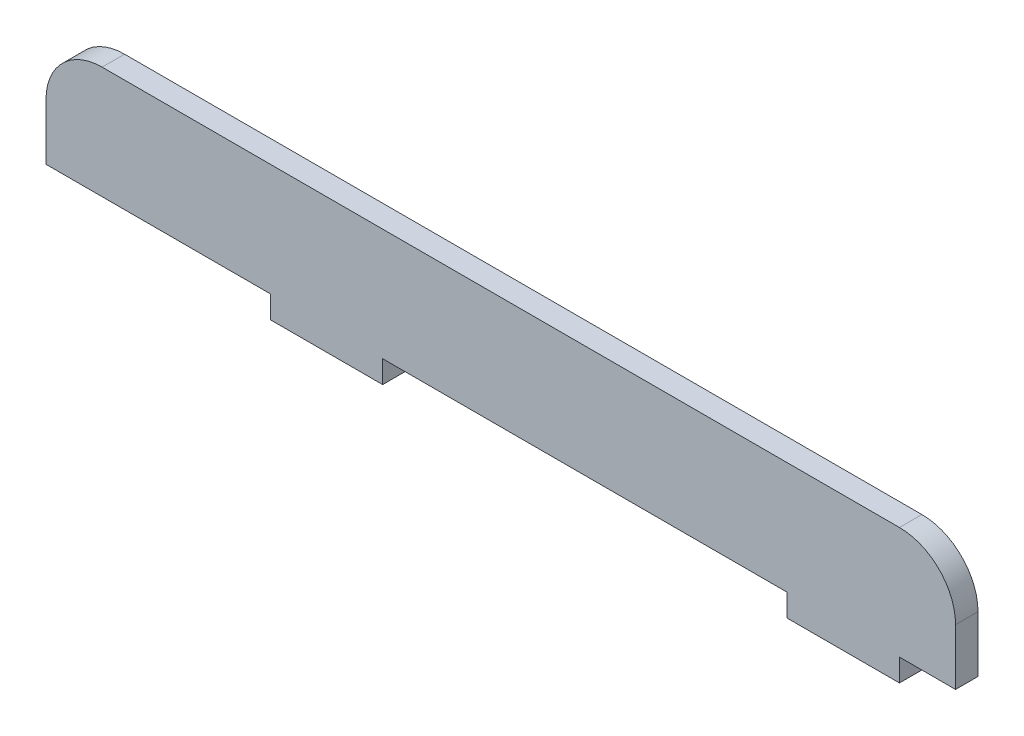
ISO-10303-21;
HEADER;
FILE_DESCRIPTION(('STEP AP214'),'2;1');
FILE_NAME('part.step','',(''),(''),'','','');
FILE_SCHEMA(('AUTOMOTIVE_DESIGN { 1 0 10303 214 1 1 1 1 }'));
ENDSEC;
DATA;
#1=APPLICATION_CONTEXT('core data for automotive mechanical design processes');
#2=APPLICATION_PROTOCOL_DEFINITION('international standard','automotive_design',2000,#1);
#3=PRODUCT_CONTEXT('',#1,'mechanical');
#4=PRODUCT('Part','Part','',(#3));
#5=PRODUCT_RELATED_PRODUCT_CATEGORY('part','',(#4));
#6=PRODUCT_DEFINITION_FORMATION('','',#4);
#7=PRODUCT_DEFINITION_CONTEXT('part definition',#1,'design');
#8=PRODUCT_DEFINITION('design','',#6,#7);
#9=PRODUCT_DEFINITION_SHAPE('','',#8);
#10=(LENGTH_UNIT() NAMED_UNIT(*) SI_UNIT(.MILLI.,.METRE.));
#11=(NAMED_UNIT(*) PLANE_ANGLE_UNIT() SI_UNIT($,.RADIAN.));
#12=(NAMED_UNIT(*) SI_UNIT($,.STERADIAN.) SOLID_ANGLE_UNIT());
#13=UNCERTAINTY_MEASURE_WITH_UNIT(LENGTH_MEASURE(1.E-05),#10,'distance_accuracy_value','');
#14=(GEOMETRIC_REPRESENTATION_CONTEXT(3) GLOBAL_UNCERTAINTY_ASSIGNED_CONTEXT((#13)) GLOBAL_UNIT_ASSIGNED_CONTEXT((#10,
#11,#12)) REPRESENTATION_CONTEXT('',''));
#15=CARTESIAN_POINT('',(0.,0.,0.));
#16=DIRECTION('',(0.,0.,1.));
#17=DIRECTION('',(1.,0.,0.));
#18=AXIS2_PLACEMENT_3D('',#15,#16,#17);
#19=CARTESIAN_POINT('',(17.9,4.,84.));
#20=DIRECTION('',(0.,1.,0.));
#21=DIRECTION('',(0.,0.,1.));
#22=AXIS2_PLACEMENT_3D('',#19,#20,#21);
#23=PLANE('',#22);
#24=DIRECTION('',(1.,0.,0.));
#25=VECTOR('',#24,1.);
#26=CARTESIAN_POINT('',(17.9,4.,80.));
#27=LINE('',#26,#25);
#28=CARTESIAN_POINT('',(-22.1,4.,80.));
#29=VERTEX_POINT('',#28);
#30=CARTESIAN_POINT('',(17.9,4.,80.));
#31=VERTEX_POINT('',#30);
#32=EDGE_CURVE('E162',#29,#31,#27,.T.);
#33=ORIENTED_EDGE('',*,*,#32,.T.);
#34=DIRECTION('',(0.,0.,-1.));
#35=VECTOR('',#34,1.);
#36=CARTESIAN_POINT('',(17.9,4.,84.));
#37=LINE('',#36,#35);
#38=CARTESIAN_POINT('',(17.9,4.,84.));
#39=VERTEX_POINT('',#38);
#40=EDGE_CURVE('E11',#39,#31,#37,.T.);
#41=ORIENTED_EDGE('',*,*,#40,.F.);
#42=DIRECTION('',(1.,0.,0.));
#43=VECTOR('',#42,1.);
#44=CARTESIAN_POINT('',(17.9,4.,84.));
#45=LINE('',#44,#43);
#46=CARTESIAN_POINT('',(-22.1,4.,84.));
#47=VERTEX_POINT('',#46);
#48=EDGE_CURVE('E188',#47,#39,#45,.T.);
#49=ORIENTED_EDGE('',*,*,#48,.F.);
#50=DIRECTION('',(0.,0.,-1.));
#51=VECTOR('',#50,1.);
#52=CARTESIAN_POINT('',(-22.1,4.,84.));
#53=LINE('',#52,#51);
#54=EDGE_CURVE('E158',#47,#29,#53,.T.);
#55=ORIENTED_EDGE('',*,*,#54,.T.);
#56=EDGE_LOOP('',(#33,#41,#49,#55));
#57=FACE_BOUND('',#56,.T.);
#58=ADVANCED_FACE('F30',(#57),#23,.F.);
#59=CARTESIAN_POINT('',(17.9,0.,84.));
#60=DIRECTION('',(1.,0.,0.));
#61=DIRECTION('',(0.,0.,-1.));
#62=AXIS2_PLACEMENT_3D('',#59,#60,#61);
#63=PLANE('',#62);
#64=DIRECTION('',(0.,-1.,0.));
#65=VECTOR('',#64,1.);
#66=CARTESIAN_POINT('',(17.9,0.,80.));
#67=LINE('',#66,#65);
#68=CARTESIAN_POINT('',(17.9,0.,80.));
#69=VERTEX_POINT('',#68);
#70=EDGE_CURVE('E165',#31,#69,#67,.T.);
#71=ORIENTED_EDGE('',*,*,#70,.T.);
#72=DIRECTION('',(0.,0.,-1.));
#73=VECTOR('',#72,1.);
#74=CARTESIAN_POINT('',(17.9,0.,84.));
#75=LINE('',#74,#73);
#76=CARTESIAN_POINT('',(17.9,0.,84.));
#77=VERTEX_POINT('',#76);
#78=EDGE_CURVE('E38',#77,#69,#75,.T.);
#79=ORIENTED_EDGE('',*,*,#78,.F.);
#80=DIRECTION('',(0.,-1.,0.));
#81=VECTOR('',#80,1.);
#82=CARTESIAN_POINT('',(17.9,0.,84.));
#83=LINE('',#82,#81);
#84=EDGE_CURVE('E107',#39,#77,#83,.T.);
#85=ORIENTED_EDGE('',*,*,#84,.F.);
#86=ORIENTED_EDGE('',*,*,#40,.T.);
#87=EDGE_LOOP('',(#71,#79,#85,#86));
#88=FACE_BOUND('',#87,.T.);
#89=ADVANCED_FACE('F276',(#88),#63,.F.);
#90=CARTESIAN_POINT('',(37.9,0.,84.));
#91=DIRECTION('',(0.,1.,0.));
#92=DIRECTION('',(0.,0.,1.));
#93=AXIS2_PLACEMENT_3D('',#90,#91,#92);
#94=PLANE('',#93);
#95=DIRECTION('',(1.,0.,0.));
#96=VECTOR('',#95,1.);
#97=CARTESIAN_POINT('',(37.9,0.,80.));
#98=LINE('',#97,#96);
#99=CARTESIAN_POINT('',(37.9,0.,80.));
#100=VERTEX_POINT('',#99);
#101=EDGE_CURVE('E167',#69,#100,#98,.T.);
#102=ORIENTED_EDGE('',*,*,#101,.T.);
#103=DIRECTION('',(0.,0.,-1.));
#104=VECTOR('',#103,1.);
#105=CARTESIAN_POINT('',(37.9,0.,84.));
#106=LINE('',#105,#104);
#107=CARTESIAN_POINT('',(37.9,0.,84.));
#108=VERTEX_POINT('',#107);
#109=EDGE_CURVE('E213',#108,#100,#106,.T.);
#110=ORIENTED_EDGE('',*,*,#109,.F.);
#111=DIRECTION('',(1.,0.,0.));
#112=VECTOR('',#111,1.);
#113=CARTESIAN_POINT('',(37.9,0.,84.));
#114=LINE('',#113,#112);
#115=EDGE_CURVE('E221',#77,#108,#114,.T.);
#116=ORIENTED_EDGE('',*,*,#115,.F.);
#117=ORIENTED_EDGE('',*,*,#78,.T.);
#118=EDGE_LOOP('',(#102,#110,#116,#117));
#119=FACE_BOUND('',#118,.T.);
#120=ADVANCED_FACE('F219',(#119),#94,.F.);
#121=CARTESIAN_POINT('',(37.9,4.,84.));
#122=DIRECTION('',(-1.,0.,0.));
#123=DIRECTION('',(0.,0.,1.));
#124=AXIS2_PLACEMENT_3D('',#121,#122,#123);
#125=PLANE('',#124);
#126=DIRECTION('',(0.,1.,0.));
#127=VECTOR('',#126,1.);
#128=CARTESIAN_POINT('',(37.9,4.,80.));
#129=LINE('',#128,#127);
#130=CARTESIAN_POINT('',(37.9,4.,80.));
#131=VERTEX_POINT('',#130);
#132=EDGE_CURVE('E169',#100,#131,#129,.T.);
#133=ORIENTED_EDGE('',*,*,#132,.T.);
#134=DIRECTION('',(0.,0.,-1.));
#135=VECTOR('',#134,1.);
#136=CARTESIAN_POINT('',(37.9,4.,84.));
#137=LINE('',#136,#135);
#138=CARTESIAN_POINT('',(37.9,4.,84.));
#139=VERTEX_POINT('',#138);
#140=EDGE_CURVE('E210',#139,#131,#137,.T.);
#141=ORIENTED_EDGE('',*,*,#140,.F.);
#142=DIRECTION('',(0.,1.,0.));
#143=VECTOR('',#142,1.);
#144=CARTESIAN_POINT('',(37.9,4.,84.));
#145=LINE('',#144,#143);
#146=EDGE_CURVE('E239',#108,#139,#145,.T.);
#147=ORIENTED_EDGE('',*,*,#146,.F.);
#148=ORIENTED_EDGE('',*,*,#109,.T.);
#149=EDGE_LOOP('',(#133,#141,#147,#148));
#150=FACE_BOUND('',#149,.T.);
#151=ADVANCED_FACE('F230',(#150),#125,.F.);
#152=CARTESIAN_POINT('',(110.,4.,84.));
#153=DIRECTION('',(0.,1.,0.));
#154=DIRECTION('',(0.,0.,1.));
#155=AXIS2_PLACEMENT_3D('',#152,#153,#154);
#156=PLANE('',#155);
#157=DIRECTION('',(1.,0.,0.));
#158=VECTOR('',#157,1.);
#159=CARTESIAN_POINT('',(110.,4.,80.));
#160=LINE('',#159,#158);
#161=CARTESIAN_POINT('',(110.,4.,80.));
#162=VERTEX_POINT('',#161);
#163=EDGE_CURVE('E171',#131,#162,#160,.T.);
#164=ORIENTED_EDGE('',*,*,#163,.T.);
#165=DIRECTION('',(0.,0.,-1.));
#166=VECTOR('',#165,1.);
#167=CARTESIAN_POINT('',(110.,4.,84.));
#168=LINE('',#167,#166);
#169=CARTESIAN_POINT('',(110.,4.,84.));
#170=VERTEX_POINT('',#169);
#171=EDGE_CURVE('E207',#170,#162,#168,.T.);
#172=ORIENTED_EDGE('',*,*,#171,.F.);
#173=DIRECTION('',(1.,0.,0.));
#174=VECTOR('',#173,1.);
#175=CARTESIAN_POINT('',(110.,4.,84.));
#176=LINE('',#175,#174);
#177=EDGE_CURVE('E236',#139,#170,#176,.T.);
#178=ORIENTED_EDGE('',*,*,#177,.F.);
#179=ORIENTED_EDGE('',*,*,#140,.T.);
#180=EDGE_LOOP('',(#164,#172,#178,#179));
#181=FACE_BOUND('',#180,.T.);
#182=ADVANCED_FACE('F234',(#181),#156,.F.);
#183=CARTESIAN_POINT('',(110.,0.,84.));
#184=DIRECTION('',(1.,0.,0.));
#185=DIRECTION('',(0.,0.,-1.));
#186=AXIS2_PLACEMENT_3D('',#183,#184,#185);
#187=PLANE('',#186);
#188=DIRECTION('',(0.,-1.,0.));
#189=VECTOR('',#188,1.);
#190=CARTESIAN_POINT('',(110.,0.,80.));
#191=LINE('',#190,#189);
#192=CARTESIAN_POINT('',(110.,0.,80.));
#193=VERTEX_POINT('',#192);
#194=EDGE_CURVE('E173',#162,#193,#191,.T.);
#195=ORIENTED_EDGE('',*,*,#194,.T.);
#196=DIRECTION('',(0.,0.,-1.));
#197=VECTOR('',#196,1.);
#198=CARTESIAN_POINT('',(110.,0.,84.));
#199=LINE('',#198,#197);
#200=CARTESIAN_POINT('',(110.,0.,84.));
#201=VERTEX_POINT('',#200);
#202=EDGE_CURVE('E204',#201,#193,#199,.T.);
#203=ORIENTED_EDGE('',*,*,#202,.F.);
#204=DIRECTION('',(0.,-1.,0.));
#205=VECTOR('',#204,1.);
#206=CARTESIAN_POINT('',(110.,0.,84.));
#207=LINE('',#206,#205);
#208=EDGE_CURVE('E238',#170,#201,#207,.T.);
#209=ORIENTED_EDGE('',*,*,#208,.F.);
#210=ORIENTED_EDGE('',*,*,#171,.T.);
#211=EDGE_LOOP('',(#195,#203,#209,#210));
#212=FACE_BOUND('',#211,.T.);
#213=ADVANCED_FACE('F289',(#212),#187,.F.);
#214=CARTESIAN_POINT('',(130.,0.,84.));
#215=DIRECTION('',(0.,1.,0.));
#216=DIRECTION('',(0.,0.,1.));
#217=AXIS2_PLACEMENT_3D('',#214,#215,#216);
#218=PLANE('',#217);
#219=DIRECTION('',(1.,0.,0.));
#220=VECTOR('',#219,1.);
#221=CARTESIAN_POINT('',(130.,0.,80.));
#222=LINE('',#221,#220);
#223=CARTESIAN_POINT('',(130.,0.,80.));
#224=VERTEX_POINT('',#223);
#225=EDGE_CURVE('E175',#193,#224,#222,.T.);
#226=ORIENTED_EDGE('',*,*,#225,.T.);
#227=DIRECTION('',(0.,0.,-1.));
#228=VECTOR('',#227,1.);
#229=CARTESIAN_POINT('',(130.,0.,84.));
#230=LINE('',#229,#228);
#231=CARTESIAN_POINT('',(130.,0.,84.));
#232=VERTEX_POINT('',#231);
#233=EDGE_CURVE('E201',#232,#224,#230,.T.);
#234=ORIENTED_EDGE('',*,*,#233,.F.);
#235=DIRECTION('',(1.,0.,0.));
#236=VECTOR('',#235,1.);
#237=CARTESIAN_POINT('',(130.,0.,84.));
#238=LINE('',#237,#236);
#239=EDGE_CURVE('E241',#201,#232,#238,.T.);
#240=ORIENTED_EDGE('',*,*,#239,.F.);
#241=ORIENTED_EDGE('',*,*,#202,.T.);
#242=EDGE_LOOP('',(#226,#234,#240,#241));
#243=FACE_BOUND('',#242,.T.);
#244=ADVANCED_FACE('F292',(#243),#218,.F.);
#245=CARTESIAN_POINT('',(130.,4.,84.));
#246=DIRECTION('',(-1.,0.,0.));
#247=DIRECTION('',(0.,0.,1.));
#248=AXIS2_PLACEMENT_3D('',#245,#246,#247);
#249=PLANE('',#248);
#250=DIRECTION('',(0.,1.,0.));
#251=VECTOR('',#250,1.);
#252=CARTESIAN_POINT('',(130.,4.,80.));
#253=LINE('',#252,#251);
#254=CARTESIAN_POINT('',(130.,4.,80.));
#255=VERTEX_POINT('',#254);
#256=EDGE_CURVE('E177',#224,#255,#253,.T.);
#257=ORIENTED_EDGE('',*,*,#256,.T.);
#258=DIRECTION('',(0.,0.,-1.));
#259=VECTOR('',#258,1.);
#260=CARTESIAN_POINT('',(130.,4.,84.));
#261=LINE('',#260,#259);
#262=CARTESIAN_POINT('',(130.,4.,84.));
#263=VERTEX_POINT('',#262);
#264=EDGE_CURVE('E198',#263,#255,#261,.T.);
#265=ORIENTED_EDGE('',*,*,#264,.F.);
#266=DIRECTION('',(0.,1.,0.));
#267=VECTOR('',#266,1.);
#268=CARTESIAN_POINT('',(130.,4.,84.));
#269=LINE('',#268,#267);
#270=EDGE_CURVE('E247',#232,#263,#269,.T.);
#271=ORIENTED_EDGE('',*,*,#270,.F.);
#272=ORIENTED_EDGE('',*,*,#233,.T.);
#273=EDGE_LOOP('',(#257,#265,#271,#272));
#274=FACE_BOUND('',#273,.T.);
#275=ADVANCED_FACE('F296',(#274),#249,.F.);
#276=CARTESIAN_POINT('',(140.,4.,84.));
#277=DIRECTION('',(0.,1.,0.));
#278=DIRECTION('',(0.,0.,1.));
#279=AXIS2_PLACEMENT_3D('',#276,#277,#278);
#280=PLANE('',#279);
#281=DIRECTION('',(1.,0.,0.));
#282=VECTOR('',#281,1.);
#283=CARTESIAN_POINT('',(140.,4.,80.));
#284=LINE('',#283,#282);
#285=CARTESIAN_POINT('',(140.,4.,80.));
#286=VERTEX_POINT('',#285);
#287=EDGE_CURVE('E179',#255,#286,#284,.T.);
#288=ORIENTED_EDGE('',*,*,#287,.T.);
#289=DIRECTION('',(0.,0.,-1.));
#290=VECTOR('',#289,1.);
#291=CARTESIAN_POINT('',(140.,4.,84.));
#292=LINE('',#291,#290);
#293=CARTESIAN_POINT('',(140.,4.,84.));
#294=VERTEX_POINT('',#293);
#295=EDGE_CURVE('E195',#294,#286,#292,.T.);
#296=ORIENTED_EDGE('',*,*,#295,.F.);
#297=DIRECTION('',(1.,0.,0.));
#298=VECTOR('',#297,1.);
#299=CARTESIAN_POINT('',(140.,4.,84.));
#300=LINE('',#299,#298);
#301=EDGE_CURVE('E249',#263,#294,#300,.T.);
#302=ORIENTED_EDGE('',*,*,#301,.F.);
#303=ORIENTED_EDGE('',*,*,#264,.T.);
#304=EDGE_LOOP('',(#288,#296,#302,#303));
#305=FACE_BOUND('',#304,.T.);
#306=ADVANCED_FACE('F300',(#305),#280,.F.);
#307=CARTESIAN_POINT('',(140.,14.,84.));
#308=DIRECTION('',(-1.,0.,0.));
#309=DIRECTION('',(0.,0.,1.));
#310=AXIS2_PLACEMENT_3D('',#307,#308,#309);
#311=PLANE('',#310);
#312=DIRECTION('',(0.,1.,0.));
#313=VECTOR('',#312,1.);
#314=CARTESIAN_POINT('',(140.,14.,80.));
#315=LINE('',#314,#313);
#316=CARTESIAN_POINT('',(140.,14.,80.));
#317=VERTEX_POINT('',#316);
#318=EDGE_CURVE('E181',#286,#317,#315,.T.);
#319=ORIENTED_EDGE('',*,*,#318,.T.);
#320=DIRECTION('',(0.,0.,-1.));
#321=VECTOR('',#320,1.);
#322=CARTESIAN_POINT('',(140.,14.,84.));
#323=LINE('',#322,#321);
#324=CARTESIAN_POINT('',(140.,14.,84.));
#325=VERTEX_POINT('',#324);
#326=EDGE_CURVE('E192',#325,#317,#323,.T.);
#327=ORIENTED_EDGE('',*,*,#326,.F.);
#328=DIRECTION('',(0.,1.,0.));
#329=VECTOR('',#328,1.);
#330=CARTESIAN_POINT('',(140.,14.,84.));
#331=LINE('',#330,#329);
#332=EDGE_CURVE('E251',#294,#325,#331,.T.);
#333=ORIENTED_EDGE('',*,*,#332,.F.);
#334=ORIENTED_EDGE('',*,*,#295,.T.);
#335=EDGE_LOOP('',(#319,#327,#333,#334));
#336=FACE_BOUND('',#335,.T.);
#337=ADVANCED_FACE('F257',(#336),#311,.F.);
#338=CARTESIAN_POINT('',(130.,14.,84.));
#339=DIRECTION('',(0.,0.,-1.));
#340=DIRECTION('',(-1.,0.,0.));
#341=AXIS2_PLACEMENT_3D('',#338,#339,#340);
#342=CYLINDRICAL_SURFACE('',#341,10.);
#343=CARTESIAN_POINT('',(130.,14.,80.));
#344=DIRECTION('',(0.,0.,1.));
#345=DIRECTION('',(-1.,0.,0.));
#346=AXIS2_PLACEMENT_3D('',#343,#344,#345);
#347=CIRCLE('',#346,10.);
#348=CARTESIAN_POINT('',(130.,24.,80.));
#349=VERTEX_POINT('',#348);
#350=EDGE_CURVE('E183',#317,#349,#347,.T.);
#351=ORIENTED_EDGE('',*,*,#350,.T.);
#352=DIRECTION('',(0.,0.,-1.));
#353=VECTOR('',#352,1.);
#354=CARTESIAN_POINT('',(130.,24.,84.));
#355=LINE('',#354,#353);
#356=CARTESIAN_POINT('',(130.,24.,84.));
#357=VERTEX_POINT('',#356);
#358=EDGE_CURVE('E153',#357,#349,#355,.T.);
#359=ORIENTED_EDGE('',*,*,#358,.F.);
#360=CARTESIAN_POINT('',(130.,14.,84.));
#361=DIRECTION('',(0.,0.,1.));
#362=DIRECTION('',(-1.,0.,0.));
#363=AXIS2_PLACEMENT_3D('',#360,#361,#362);
#364=CIRCLE('',#363,10.);
#365=EDGE_CURVE('E144',#325,#357,#364,.T.);
#366=ORIENTED_EDGE('',*,*,#365,.F.);
#367=ORIENTED_EDGE('',*,*,#326,.T.);
#368=EDGE_LOOP('',(#351,#359,#366,#367));
#369=FACE_BOUND('',#368,.T.);
#370=ADVANCED_FACE('F261',(#369),#342,.T.);
#371=CARTESIAN_POINT('',(-12.0999999999999,24.,84.));
#372=DIRECTION('',(0.,-1.,0.));
#373=DIRECTION('',(1.,0.,0.));
#374=AXIS2_PLACEMENT_3D('',#371,#372,#373);
#375=PLANE('',#374);
#376=DIRECTION('',(-1.,0.,0.));
#377=VECTOR('',#376,1.);
#378=CARTESIAN_POINT('',(-12.0999999999999,24.,80.));
#379=LINE('',#378,#377);
#380=CARTESIAN_POINT('',(-12.0999999999999,24.,80.));
#381=VERTEX_POINT('',#380);
#382=EDGE_CURVE('E152',#349,#381,#379,.T.);
#383=ORIENTED_EDGE('',*,*,#382,.T.);
#384=DIRECTION('',(0.,0.,-1.));
#385=VECTOR('',#384,1.);
#386=CARTESIAN_POINT('',(-12.0999999999999,24.,84.));
#387=LINE('',#386,#385);
#388=CARTESIAN_POINT('',(-12.0999999999999,24.,84.));
#389=VERTEX_POINT('',#388);
#390=EDGE_CURVE('E149',#389,#381,#387,.T.);
#391=ORIENTED_EDGE('',*,*,#390,.F.);
#392=DIRECTION('',(-1.,0.,0.));
#393=VECTOR('',#392,1.);
#394=CARTESIAN_POINT('',(-12.0999999999999,24.,84.));
#395=LINE('',#394,#393);
#396=EDGE_CURVE('E138',#357,#389,#395,.T.);
#397=ORIENTED_EDGE('',*,*,#396,.F.);
#398=ORIENTED_EDGE('',*,*,#358,.T.);
#399=EDGE_LOOP('',(#383,#391,#397,#398));
#400=FACE_BOUND('',#399,.T.);
#401=ADVANCED_FACE('F150',(#400),#375,.F.);
#402=CARTESIAN_POINT('',(-12.1,14.,84.));
#403=DIRECTION('',(0.,0.,-1.));
#404=DIRECTION('',(-1.,0.,0.));
#405=AXIS2_PLACEMENT_3D('',#402,#403,#404);
#406=CYLINDRICAL_SURFACE('',#405,10.);
#407=CARTESIAN_POINT('',(-12.1,14.,80.));
#408=DIRECTION('',(0.,0.,1.));
#409=DIRECTION('',(-1.,0.,0.));
#410=AXIS2_PLACEMENT_3D('',#407,#408,#409);
#411=CIRCLE('',#410,10.);
#412=CARTESIAN_POINT('',(-22.1,13.9999999999999,80.));
#413=VERTEX_POINT('',#412);
#414=EDGE_CURVE('E93',#381,#413,#411,.T.);
#415=ORIENTED_EDGE('',*,*,#414,.T.);
#416=DIRECTION('',(0.,0.,-1.));
#417=VECTOR('',#416,1.);
#418=CARTESIAN_POINT('',(-22.1,13.9999999999999,84.));
#419=LINE('',#418,#417);
#420=CARTESIAN_POINT('',(-22.1,13.9999999999999,84.));
#421=VERTEX_POINT('',#420);
#422=EDGE_CURVE('E154',#421,#413,#419,.T.);
#423=ORIENTED_EDGE('',*,*,#422,.F.);
#424=CARTESIAN_POINT('',(-12.1,14.,84.));
#425=DIRECTION('',(0.,0.,1.));
#426=DIRECTION('',(-1.,0.,0.));
#427=AXIS2_PLACEMENT_3D('',#424,#425,#426);
#428=CIRCLE('',#427,10.);
#429=EDGE_CURVE('E142',#389,#421,#428,.T.);
#430=ORIENTED_EDGE('',*,*,#429,.F.);
#431=ORIENTED_EDGE('',*,*,#390,.T.);
#432=EDGE_LOOP('',(#415,#423,#430,#431));
#433=FACE_BOUND('',#432,.T.);
#434=ADVANCED_FACE('F156',(#433),#406,.T.);
#435=CARTESIAN_POINT('',(-22.1,4.,84.));
#436=DIRECTION('',(1.,0.,0.));
#437=DIRECTION('',(0.,0.,-1.));
#438=AXIS2_PLACEMENT_3D('',#435,#436,#437);
#439=PLANE('',#438);
#440=DIRECTION('',(0.,-1.,0.));
#441=VECTOR('',#440,1.);
#442=CARTESIAN_POINT('',(-22.1,4.,80.));
#443=LINE('',#442,#441);
#444=EDGE_CURVE('E99',#413,#29,#443,.T.);
#445=ORIENTED_EDGE('',*,*,#444,.T.);
#446=ORIENTED_EDGE('',*,*,#54,.F.);
#447=DIRECTION('',(0.,-1.,0.));
#448=VECTOR('',#447,1.);
#449=CARTESIAN_POINT('',(-22.1,4.,84.));
#450=LINE('',#449,#448);
#451=EDGE_CURVE('E46',#421,#47,#450,.T.);
#452=ORIENTED_EDGE('',*,*,#451,.F.);
#453=ORIENTED_EDGE('',*,*,#422,.T.);
#454=EDGE_LOOP('',(#445,#446,#452,#453));
#455=FACE_BOUND('',#454,.T.);
#456=ADVANCED_FACE('F265',(#455),#439,.F.);
#457=CARTESIAN_POINT('',(-12.1,14.,84.));
#458=DIRECTION('',(0.,0.,-1.));
#459=DIRECTION('',(-1.,0.,0.));
#460=AXIS2_PLACEMENT_3D('',#457,#458,#459);
#461=PLANE('',#460);
#462=ORIENTED_EDGE('',*,*,#48,.T.);
#463=ORIENTED_EDGE('',*,*,#84,.T.);
#464=ORIENTED_EDGE('',*,*,#115,.T.);
#465=ORIENTED_EDGE('',*,*,#146,.T.);
#466=ORIENTED_EDGE('',*,*,#177,.T.);
#467=ORIENTED_EDGE('',*,*,#208,.T.);
#468=ORIENTED_EDGE('',*,*,#239,.T.);
#469=ORIENTED_EDGE('',*,*,#270,.T.);
#470=ORIENTED_EDGE('',*,*,#301,.T.);
#471=ORIENTED_EDGE('',*,*,#332,.T.);
#472=ORIENTED_EDGE('',*,*,#365,.T.);
#473=ORIENTED_EDGE('',*,*,#396,.T.);
#474=ORIENTED_EDGE('',*,*,#429,.T.);
#475=ORIENTED_EDGE('',*,*,#451,.T.);
#476=EDGE_LOOP('',(#462,#463,#464,#465,#466,#467,#468,#469,#470,#471,#472,#473,#474,#475));
#477=FACE_BOUND('',#476,.T.);
#478=ADVANCED_FACE('F140',(#477),#461,.F.);
#479=CARTESIAN_POINT('',(-12.1,14.,80.));
#480=DIRECTION('',(0.,0.,-1.));
#481=DIRECTION('',(-1.,0.,0.));
#482=AXIS2_PLACEMENT_3D('',#479,#480,#481);
#483=PLANE('',#482);
#484=ORIENTED_EDGE('',*,*,#32,.F.);
#485=ORIENTED_EDGE('',*,*,#444,.F.);
#486=ORIENTED_EDGE('',*,*,#414,.F.);
#487=ORIENTED_EDGE('',*,*,#382,.F.);
#488=ORIENTED_EDGE('',*,*,#350,.F.);
#489=ORIENTED_EDGE('',*,*,#318,.F.);
#490=ORIENTED_EDGE('',*,*,#287,.F.);
#491=ORIENTED_EDGE('',*,*,#256,.F.);
#492=ORIENTED_EDGE('',*,*,#225,.F.);
#493=ORIENTED_EDGE('',*,*,#194,.F.);
#494=ORIENTED_EDGE('',*,*,#163,.F.);
#495=ORIENTED_EDGE('',*,*,#132,.F.);
#496=ORIENTED_EDGE('',*,*,#101,.F.);
#497=ORIENTED_EDGE('',*,*,#70,.F.);
#498=EDGE_LOOP('',(#484,#485,#486,#487,#488,#489,#490,#491,#492,#493,#494,#495,#496,#497));
#499=FACE_BOUND('',#498,.T.);
#500=ADVANCED_FACE('F225',(#499),#483,.T.);
#501=CLOSED_SHELL('',(#58,#89,#120,#151,#182,#213,#244,#275,#306,#337,#370,#401,#434,#456,#478,#500));
#502=MANIFOLD_SOLID_BREP('B2',#501);
#503=ADVANCED_BREP_SHAPE_REPRESENTATION('',(#18,#502),#14);
#504=SHAPE_DEFINITION_REPRESENTATION(#9,#503);
ENDSEC;
END-ISO-10303-21;
